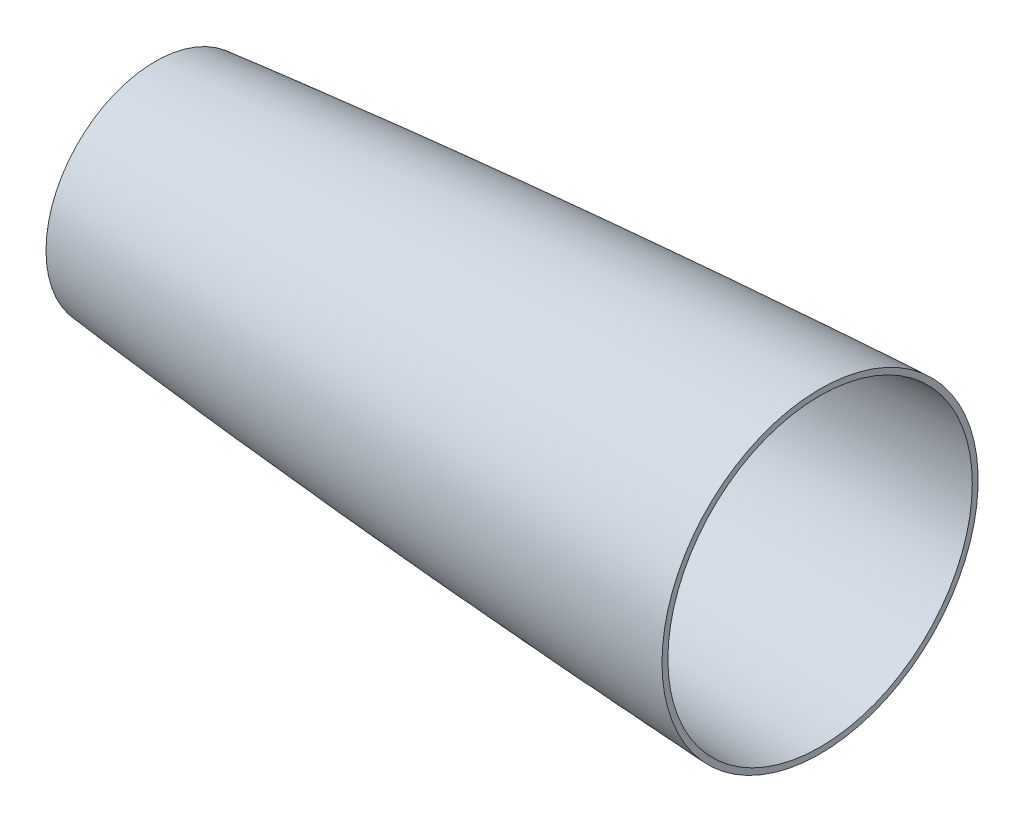
ISO-10303-21;
HEADER;
FILE_DESCRIPTION(('STEP AP214'),'2;1');
FILE_NAME('part.step','',(''),(''),'','','');
FILE_SCHEMA(('AUTOMOTIVE_DESIGN { 1 0 10303 214 1 1 1 1 }'));
ENDSEC;
DATA;
#1=APPLICATION_CONTEXT('core data for automotive mechanical design processes');
#2=APPLICATION_PROTOCOL_DEFINITION('international standard','automotive_design',2000,#1);
#3=PRODUCT_CONTEXT('',#1,'mechanical');
#4=PRODUCT('Part','Part','',(#3));
#5=PRODUCT_RELATED_PRODUCT_CATEGORY('part','',(#4));
#6=PRODUCT_DEFINITION_FORMATION('','',#4);
#7=PRODUCT_DEFINITION_CONTEXT('part definition',#1,'design');
#8=PRODUCT_DEFINITION('design','',#6,#7);
#9=PRODUCT_DEFINITION_SHAPE('','',#8);
#10=(LENGTH_UNIT() NAMED_UNIT(*) SI_UNIT(.MILLI.,.METRE.));
#11=(NAMED_UNIT(*) PLANE_ANGLE_UNIT() SI_UNIT($,.RADIAN.));
#12=(NAMED_UNIT(*) SI_UNIT($,.STERADIAN.) SOLID_ANGLE_UNIT());
#13=UNCERTAINTY_MEASURE_WITH_UNIT(LENGTH_MEASURE(1.E-05),#10,'distance_accuracy_value','');
#14=(GEOMETRIC_REPRESENTATION_CONTEXT(3) GLOBAL_UNCERTAINTY_ASSIGNED_CONTEXT((#13)) GLOBAL_UNIT_ASSIGNED_CONTEXT((#10,
#11,#12)) REPRESENTATION_CONTEXT('',''));
#15=CARTESIAN_POINT('',(0.,0.,0.));
#16=DIRECTION('',(0.,0.,1.));
#17=DIRECTION('',(1.,0.,0.));
#18=AXIS2_PLACEMENT_3D('',#15,#16,#17);
#19=CARTESIAN_POINT('',(372.39999359028,0.,-44.2733027624963));
#20=CARTESIAN_POINT('',(371.099714053135,0.,-44.2086080110827));
#21=CARTESIAN_POINT('',(368.611062849186,0.,-44.0832993392099));
#22=CARTESIAN_POINT('',(362.148151184641,0.,-43.7550336289242));
#23=CARTESIAN_POINT('',(357.349401431345,0.,-43.4983162933738));
#24=CARTESIAN_POINT('',(350.247962447512,0.,-43.1179460373823));
#25=CARTESIAN_POINT('',(344.538040115151,0.,-42.7976556461814));
#26=CARTESIAN_POINT('',(337.985384405271,0.,-42.4262032706557));
#27=CARTESIAN_POINT('',(331.944862255008,0.,-42.0709226975757));
#28=CARTESIAN_POINT('',(325.595017121021,0.,-41.6908527670282));
#29=CARTESIAN_POINT('',(319.43237001312,0.,-41.3106172984506));
#30=CARTESIAN_POINT('',(313.159713413832,0.,-40.9153205851627));
#31=CARTESIAN_POINT('',(306.950403048607,0.,-40.5135118028268));
#32=CARTESIAN_POINT('',(299.150130155928,0.,-39.9970769330811));
#33=CARTESIAN_POINT('',(289.813463409145,0.,-39.3587913635827));
#34=CARTESIAN_POINT('',(279.058984170223,0.,-38.594812009374));
#35=CARTESIAN_POINT('',(268.317681549175,0.,-37.7965587549326));
#36=CARTESIAN_POINT('',(259.127235962272,0.,-37.088005815583));
#37=CARTESIAN_POINT('',(251.501013914446,0.,-36.4827815592879));
#38=CARTESIAN_POINT('',(245.27268003071,0.,-35.977392449166));
#39=CARTESIAN_POINT('',(239.057194673673,0.,-35.4620487220798));
#40=CARTESIAN_POINT('',(232.822774930748,0.,-34.9334280749946));
#41=CARTESIAN_POINT('',(226.622201610408,0.,-34.3966087595046));
#42=CARTESIAN_POINT('',(220.368425406998,0.,-33.8426363682032));
#43=CARTESIAN_POINT('',(214.205416019316,0.,-33.2857774492992));
#44=CARTESIAN_POINT('',(207.893679348072,0.,-32.7016756399895));
#45=CARTESIAN_POINT('',(201.840880215998,0.,-32.1311448568726));
#46=CARTESIAN_POINT('',(196.124448634676,0.,-31.5784073937224));
#47=CARTESIAN_POINT('',(191.918839359558,0.,-31.166401440023));
#48=CARTESIAN_POINT('',(188.168070472796,0.,-30.7918833396455));
#49=CARTESIAN_POINT('',(186.847658800442,0.,-30.6594159771514));
#50=CARTESIAN_POINT('',(186.199993590876,0.,-30.594163563066));
#51=B_SPLINE_CURVE_WITH_KNOTS('',4,(#19,#20,#21,#22,#23,#24,#25,#26,#27,#28,#29,#30,#31,#32,#33,
#34,#35,#36,#37,#38,#39,#40,#41,#42,#43,#44,#45,#46,#47,#48,#49,#50),.UNSPECIFIED.,.F.,.F.,(5,1,
1,1,1,1,1,1,1,1,1,1,1,1,1,1,1,1,1,1,1,1,1,1,1,1,1,1,5),(0.0827768049121336,0.110666225959127,
0.138555646953199,0.166445067976052,0.194334488998905,0.222223910051479,0.250113331104054,
0.278002752192979,0.305892173281903,0.333781594407322,0.361671015532741,0.389560436613693,
0.417449857694646,0.473228699690767,0.529007541725588,0.582068952844539,0.609958373536778,
0.63784779481284,0.665737215771018,0.693626637366351,0.721516058237757,0.74940547947162,
0.777294899906134,0.805184321042163,0.833073741721063,0.860963163441835,0.888852584259991,
0.902797295247897,0.916742006181757),.UNSPECIFIED.);
#52=CARTESIAN_POINT('',(186.199993600708,0.,0.));
#53=DIRECTION('',(-1.,0.,0.));
#54=AXIS1_PLACEMENT('',#52,#53);
#55=SURFACE_OF_REVOLUTION('',#51,#54);
#56=CARTESIAN_POINT('',(186.199993600708,0.,0.));
#57=DIRECTION('',(-1.,0.,0.));
#58=DIRECTION('',(0.,0.,1.));
#59=AXIS2_PLACEMENT_3D('',#56,#57,#58);
#60=CIRCLE('',#59,30.5941635640566);
#61=CARTESIAN_POINT('',(186.199993600708,0.,30.5941635640566));
#62=VERTEX_POINT('',#61);
#63=EDGE_CURVE('E10',#62,#62,#60,.T.);
#64=ORIENTED_EDGE('',*,*,#63,.F.);
#65=EDGE_LOOP('',(#64));
#66=FACE_BOUND('',#65,.T.);
#67=CARTESIAN_POINT('',(372.399993600149,0.,0.));
#68=DIRECTION('',(-1.,0.,0.));
#69=DIRECTION('',(0.,0.,1.));
#70=AXIS2_PLACEMENT_3D('',#67,#68,#69);
#71=CIRCLE('',#70,44.2733027629921);
#72=CARTESIAN_POINT('',(372.399993600149,0.,44.2733027629921));
#73=VERTEX_POINT('',#72);
#74=EDGE_CURVE('E53',#73,#73,#71,.T.);
#75=ORIENTED_EDGE('',*,*,#74,.T.);
#76=EDGE_LOOP('',(#75));
#77=FACE_BOUND('',#76,.T.);
#78=ADVANCED_FACE('F45',(#66,#77),#55,.T.);
#79=CARTESIAN_POINT('',(186.199993600708,0.,-30.5941635640566));
#80=DIRECTION('',(1.,0.,0.));
#81=DIRECTION('',(0.,0.,-1.));
#82=AXIS2_PLACEMENT_3D('',#79,#80,#81);
#83=PLANE('',#82);
#84=CARTESIAN_POINT('',(186.199993600708,0.,0.));
#85=DIRECTION('',(1.,0.,0.));
#86=DIRECTION('',(0.,0.,-1.));
#87=AXIS2_PLACEMENT_3D('',#84,#85,#86);
#88=CIRCLE('',#87,29.1106019335391);
#89=CARTESIAN_POINT('',(186.199993600708,0.,-29.1106019335391));
#90=VERTEX_POINT('',#89);
#91=EDGE_CURVE('E63',#90,#90,#88,.T.);
#92=ORIENTED_EDGE('',*,*,#91,.T.);
#93=EDGE_LOOP('',(#92));
#94=FACE_BOUND('',#93,.T.);
#95=ORIENTED_EDGE('',*,*,#63,.T.);
#96=EDGE_LOOP('',(#95));
#97=FACE_BOUND('',#96,.T.);
#98=ADVANCED_FACE('F47',(#94,#97),#83,.F.);
#99=CARTESIAN_POINT('',(372.399993600149,0.,0.));
#100=DIRECTION('',(-1.,0.,0.));
#101=DIRECTION('',(0.,0.,1.));
#102=AXIS2_PLACEMENT_3D('',#99,#100,#101);
#103=PLANE('',#102);
#104=CARTESIAN_POINT('',(372.399993600149,0.,0.));
#105=DIRECTION('',(-1.,0.,0.));
#106=DIRECTION('',(0.,0.,1.));
#107=AXIS2_PLACEMENT_3D('',#104,#105,#106);
#108=CIRCLE('',#107,42.6312730017438);
#109=CARTESIAN_POINT('',(372.399993600149,0.,42.6312730017438));
#110=VERTEX_POINT('',#109);
#111=EDGE_CURVE('E58',#110,#110,#108,.T.);
#112=ORIENTED_EDGE('',*,*,#111,.T.);
#113=EDGE_LOOP('',(#112));
#114=FACE_BOUND('',#113,.T.);
#115=ORIENTED_EDGE('',*,*,#74,.F.);
#116=EDGE_LOOP('',(#115));
#117=FACE_BOUND('',#116,.T.);
#118=ADVANCED_FACE('F80',(#114,#117),#103,.F.);
#119=CARTESIAN_POINT('',(372.39999359028,0.,-44.2733027624963));
#120=CARTESIAN_POINT('',(371.099714053135,0.,-44.2086080110827));
#121=CARTESIAN_POINT('',(368.611062849186,0.,-44.0832993392099));
#122=CARTESIAN_POINT('',(362.148151184641,0.,-43.7550336289242));
#123=CARTESIAN_POINT('',(357.349401431345,0.,-43.4983162933738));
#124=CARTESIAN_POINT('',(350.247962447512,0.,-43.1179460373823));
#125=CARTESIAN_POINT('',(344.538040115151,0.,-42.7976556461814));
#126=CARTESIAN_POINT('',(337.985384405271,0.,-42.4262032706557));
#127=CARTESIAN_POINT('',(331.944862255008,0.,-42.0709226975757));
#128=CARTESIAN_POINT('',(325.595017121021,0.,-41.6908527670282));
#129=CARTESIAN_POINT('',(319.43237001312,0.,-41.3106172984506));
#130=CARTESIAN_POINT('',(313.159713413832,0.,-40.9153205851627));
#131=CARTESIAN_POINT('',(306.950403048607,0.,-40.5135118028268));
#132=CARTESIAN_POINT('',(299.150130155928,0.,-39.9970769330811));
#133=CARTESIAN_POINT('',(289.813463409145,0.,-39.3587913635827));
#134=CARTESIAN_POINT('',(279.058984170223,0.,-38.594812009374));
#135=CARTESIAN_POINT('',(268.317681549175,0.,-37.7965587549326));
#136=CARTESIAN_POINT('',(259.127235962272,0.,-37.088005815583));
#137=CARTESIAN_POINT('',(251.501013914446,0.,-36.4827815592879));
#138=CARTESIAN_POINT('',(245.27268003071,0.,-35.977392449166));
#139=CARTESIAN_POINT('',(239.057194673673,0.,-35.4620487220798));
#140=CARTESIAN_POINT('',(232.822774930748,0.,-34.9334280749946));
#141=CARTESIAN_POINT('',(226.622201610408,0.,-34.3966087595046));
#142=CARTESIAN_POINT('',(220.368425406998,0.,-33.8426363682032));
#143=CARTESIAN_POINT('',(214.205416019316,0.,-33.2857774492992));
#144=CARTESIAN_POINT('',(207.893679348072,0.,-32.7016756399895));
#145=CARTESIAN_POINT('',(201.840880215998,0.,-32.1311448568726));
#146=CARTESIAN_POINT('',(196.124448634676,0.,-31.5784073937224));
#147=CARTESIAN_POINT('',(191.918839359558,0.,-31.166401440023));
#148=CARTESIAN_POINT('',(188.168070472796,0.,-30.7918833396455));
#149=CARTESIAN_POINT('',(186.847658800442,0.,-30.6594159771514));
#150=CARTESIAN_POINT('',(186.199993590876,0.,-30.594163563066));
#151=B_SPLINE_CURVE_WITH_KNOTS('',4,(#119,#120,#121,#122,#123,#124,#125,#126,#127,#128,#129,
#130,#131,#132,#133,#134,#135,#136,#137,#138,#139,#140,#141,#142,#143,#144,#145,#146,#147,#148,
#149,#150),.UNSPECIFIED.,.F.,.F.,(5,1,1,1,1,1,1,1,1,1,1,1,1,1,1,1,1,1,1,1,1,1,1,1,1,1,1,1,5),
(0.0827768049121336,0.110666225959127,0.138555646953199,0.166445067976052,0.194334488998905,
0.222223910051479,0.250113331104054,0.278002752192979,0.305892173281903,0.333781594407322,
0.361671015532741,0.389560436613693,0.417449857694646,0.473228699690767,0.529007541725588,
0.582068952844539,0.609958373536778,0.63784779481284,0.665737215771018,0.693626637366351,
0.721516058237757,0.74940547947162,0.777294899906134,0.805184321042163,0.833073741721063,
0.860963163441835,0.888852584259991,0.902797295247897,0.916742006181757),.UNSPECIFIED.);
#152=CARTESIAN_POINT('',(186.199993600708,0.,0.));
#153=DIRECTION('',(-1.,0.,0.));
#154=AXIS1_PLACEMENT('',#152,#153);
#155=SURFACE_OF_REVOLUTION('',#151,#154);
#156=OFFSET_SURFACE('',#155,-1.64,.F.);
#157=CARTESIAN_POINT('',(187.839993600708,0.,0.));
#158=DIRECTION('',(1.,0.,0.));
#159=DIRECTION('',(0.,0.,-1.));
#160=AXIS2_PLACEMENT_3D('',#157,#158,#159);
#161=CIRCLE('',#160,29.1106019335391);
#162=CARTESIAN_POINT('',(187.839993600708,0.,-29.1106019335391));
#163=VERTEX_POINT('',#162);
#164=EDGE_CURVE('E101',#163,#163,#161,.T.);
#165=ORIENTED_EDGE('',*,*,#164,.F.);
#166=EDGE_LOOP('',(#165));
#167=FACE_BOUND('',#166,.T.);
#168=ORIENTED_EDGE('',*,*,#111,.F.);
#169=EDGE_LOOP('',(#168));
#170=FACE_BOUND('',#169,.T.);
#171=ADVANCED_FACE('F78',(#167,#170),#156,.F.);
#172=CARTESIAN_POINT('',(177.839993600708,0.,0.));
#173=DIRECTION('',(1.,0.,0.));
#174=DIRECTION('',(0.,0.,-1.));
#175=AXIS2_PLACEMENT_3D('',#172,#173,#174);
#176=CYLINDRICAL_SURFACE('',#175,29.1106019335391);
#177=ORIENTED_EDGE('',*,*,#164,.T.);
#178=EDGE_LOOP('',(#177));
#179=FACE_BOUND('',#178,.T.);
#180=ORIENTED_EDGE('',*,*,#91,.F.);
#181=EDGE_LOOP('',(#180));
#182=FACE_BOUND('',#181,.T.);
#183=ADVANCED_FACE('F87',(#179,#182),#176,.F.);
#184=CLOSED_SHELL('',(#78,#98,#118,#171,#183));
#185=MANIFOLD_SOLID_BREP('B2',#184);
#186=ADVANCED_BREP_SHAPE_REPRESENTATION('',(#18,#185),#14);
#187=SHAPE_DEFINITION_REPRESENTATION(#9,#186);
ENDSEC;
END-ISO-10303-21;
